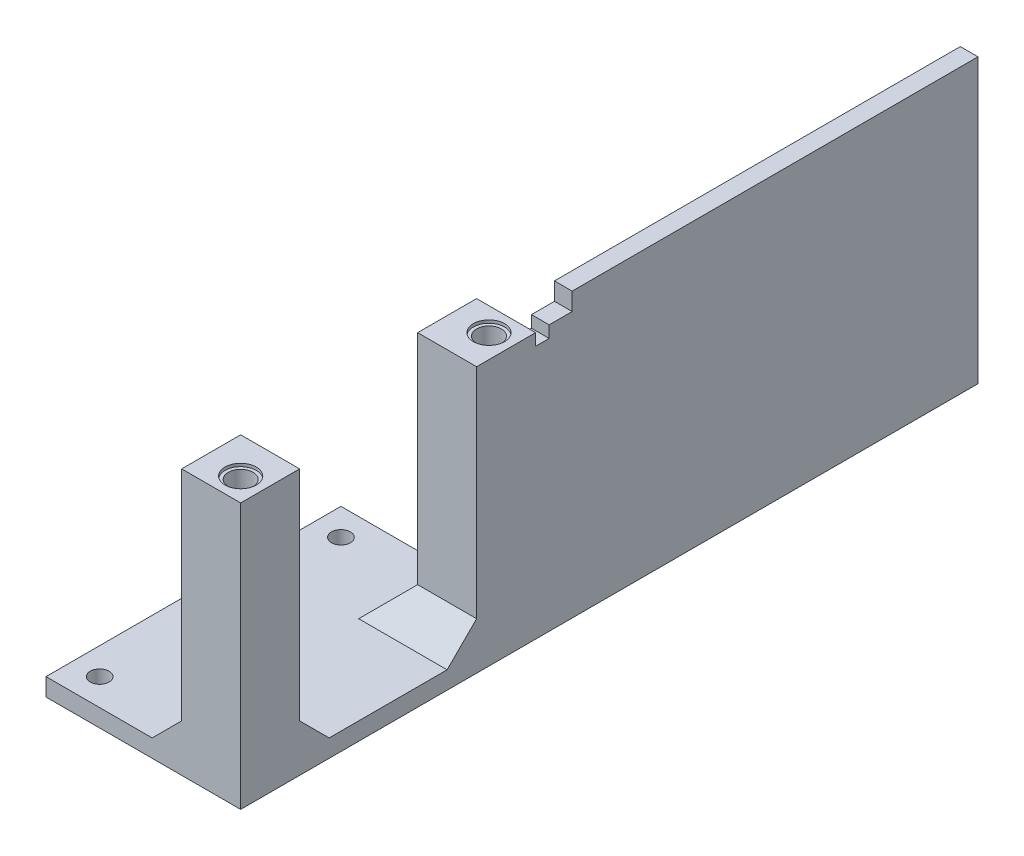
ISO-10303-21;
HEADER;
FILE_DESCRIPTION(('STEP AP214'),'2;1');
FILE_NAME('part.step','',(''),(''),'','','');
FILE_SCHEMA(('AUTOMOTIVE_DESIGN { 1 0 10303 214 1 1 1 1 }'));
ENDSEC;
DATA;
#1=APPLICATION_CONTEXT('core data for automotive mechanical design processes');
#2=APPLICATION_PROTOCOL_DEFINITION('international standard','automotive_design',2000,#1);
#3=PRODUCT_CONTEXT('',#1,'mechanical');
#4=PRODUCT('Part','Part','',(#3));
#5=PRODUCT_RELATED_PRODUCT_CATEGORY('part','',(#4));
#6=PRODUCT_DEFINITION_FORMATION('','',#4);
#7=PRODUCT_DEFINITION_CONTEXT('part definition',#1,'design');
#8=PRODUCT_DEFINITION('design','',#6,#7);
#9=PRODUCT_DEFINITION_SHAPE('','',#8);
#10=(LENGTH_UNIT() NAMED_UNIT(*) SI_UNIT(.MILLI.,.METRE.));
#11=(NAMED_UNIT(*) PLANE_ANGLE_UNIT() SI_UNIT($,.RADIAN.));
#12=(NAMED_UNIT(*) SI_UNIT($,.STERADIAN.) SOLID_ANGLE_UNIT());
#13=UNCERTAINTY_MEASURE_WITH_UNIT(LENGTH_MEASURE(1.E-05),#10,'distance_accuracy_value','');
#14=(GEOMETRIC_REPRESENTATION_CONTEXT(3) GLOBAL_UNCERTAINTY_ASSIGNED_CONTEXT((#13)) GLOBAL_UNIT_ASSIGNED_CONTEXT((#10,
#11,#12)) REPRESENTATION_CONTEXT('',''));
#15=CARTESIAN_POINT('',(0.,0.,0.));
#16=DIRECTION('',(0.,0.,1.));
#17=DIRECTION('',(1.,0.,0.));
#18=AXIS2_PLACEMENT_3D('',#15,#16,#17);
#19=CARTESIAN_POINT('',(0.,45.,0.));
#20=DIRECTION('',(0.,-1.,0.));
#21=DIRECTION('',(0.,0.,-1.));
#22=AXIS2_PLACEMENT_3D('',#19,#20,#21);
#23=PLANE('',#22);
#24=DIRECTION('',(1.,0.,0.));
#25=VECTOR('',#24,1.);
#26=CARTESIAN_POINT('',(23.4876033057851,45.,-15.8859504132231));
#27=LINE('',#26,#25);
#28=CARTESIAN_POINT('',(23.4876033057851,45.,-15.8859504132231));
#29=VERTEX_POINT('',#28);
#30=CARTESIAN_POINT('',(26.4876033057851,45.,-15.8859504132231));
#31=VERTEX_POINT('',#30);
#32=EDGE_CURVE('E106',#29,#31,#27,.T.);
#33=ORIENTED_EDGE('',*,*,#32,.F.);
#34=DIRECTION('',(0.,0.,1.));
#35=VECTOR('',#34,1.);
#36=CARTESIAN_POINT('',(23.4876033057851,45.,-11.9859504132231));
#37=LINE('',#36,#35);
#38=CARTESIAN_POINT('',(23.4876033057851,45.,-11.9859504132231));
#39=VERTEX_POINT('',#38);
#40=EDGE_CURVE('E247',#29,#39,#37,.T.);
#41=ORIENTED_EDGE('',*,*,#40,.T.);
#42=DIRECTION('',(1.,0.,0.));
#43=VECTOR('',#42,1.);
#44=CARTESIAN_POINT('',(23.4876033057851,45.,-11.9859504132231));
#45=LINE('',#44,#43);
#46=CARTESIAN_POINT('',(26.4876033057851,45.,-11.9859504132231));
#47=VERTEX_POINT('',#46);
#48=EDGE_CURVE('E259',#39,#47,#45,.T.);
#49=ORIENTED_EDGE('',*,*,#48,.T.);
#50=DIRECTION('',(0.,0.,-1.));
#51=VECTOR('',#50,1.);
#52=CARTESIAN_POINT('',(26.4876033057851,45.,-11.9859504132231));
#53=LINE('',#52,#51);
#54=EDGE_CURVE('E102',#47,#31,#53,.T.);
#55=ORIENTED_EDGE('',*,*,#54,.T.);
#56=EDGE_LOOP('',(#33,#41,#49,#55));
#57=FACE_BOUND('',#56,.T.);
#58=ADVANCED_FACE('F83',(#57),#23,.F.);
#59=CARTESIAN_POINT('',(26.4876033057851,43.,-84.6859504132231));
#60=DIRECTION('',(0.,-1.,0.));
#61=DIRECTION('',(0.,0.,-1.));
#62=AXIS2_PLACEMENT_3D('',#59,#60,#61);
#63=PLANE('',#62);
#64=DIRECTION('',(1.,0.,0.));
#65=VECTOR('',#64,1.);
#66=CARTESIAN_POINT('',(23.4876033057851,43.,-11.9859504132231));
#67=LINE('',#66,#65);
#68=CARTESIAN_POINT('',(23.4876033057851,43.,-11.9859504132231));
#69=VERTEX_POINT('',#68);
#70=CARTESIAN_POINT('',(26.4876033057851,43.,-11.9859504132231));
#71=VERTEX_POINT('',#70);
#72=EDGE_CURVE('E249',#69,#71,#67,.T.);
#73=ORIENTED_EDGE('',*,*,#72,.F.);
#74=DIRECTION('',(0.,0.,1.));
#75=VECTOR('',#74,1.);
#76=CARTESIAN_POINT('',(23.4876033057851,43.,-84.6859504132231));
#77=LINE('',#76,#75);
#78=CARTESIAN_POINT('',(23.4876033057851,43.,-9.68595041322314));
#79=VERTEX_POINT('',#78);
#80=EDGE_CURVE('E291',#69,#79,#77,.T.);
#81=ORIENTED_EDGE('',*,*,#80,.T.);
#82=DIRECTION('',(1.,0.,0.));
#83=VECTOR('',#82,1.);
#84=CARTESIAN_POINT('',(26.4876033057851,43.,-9.68595041322314));
#85=LINE('',#84,#83);
#86=CARTESIAN_POINT('',(26.4876033057851,43.,-9.68595041322314));
#87=VERTEX_POINT('',#86);
#88=EDGE_CURVE('E277',#79,#87,#85,.T.);
#89=ORIENTED_EDGE('',*,*,#88,.T.);
#90=DIRECTION('',(0.,0.,1.));
#91=VECTOR('',#90,1.);
#92=CARTESIAN_POINT('',(26.4876033057851,43.,-84.6859504132231));
#93=LINE('',#92,#91);
#94=EDGE_CURVE('E283',#71,#87,#93,.T.);
#95=ORIENTED_EDGE('',*,*,#94,.F.);
#96=EDGE_LOOP('',(#73,#81,#89,#95));
#97=FACE_BOUND('',#96,.T.);
#98=ADVANCED_FACE('F505',(#97),#63,.F.);
#99=CARTESIAN_POINT('',(22.5376033057851,-7.,-5.73595041322314));
#100=DIRECTION('',(0.,1.,0.));
#101=DIRECTION('',(0.,0.,1.));
#102=AXIS2_PLACEMENT_3D('',#99,#100,#101);
#103=CYLINDRICAL_SURFACE('',#102,2.1);
#104=CARTESIAN_POINT('',(22.5376033057851,44.5,-5.73595041322314));
#105=DIRECTION('',(0.,1.,0.));
#106=DIRECTION('',(0.,0.,1.));
#107=AXIS2_PLACEMENT_3D('',#104,#105,#106);
#108=CIRCLE('',#107,2.1);
#109=CARTESIAN_POINT('',(22.5376033057851,44.5,-3.63595041322314));
#110=VERTEX_POINT('',#109);
#111=EDGE_CURVE('E486',#110,#110,#108,.F.);
#112=ORIENTED_EDGE('',*,*,#111,.F.);
#113=EDGE_LOOP('',(#112));
#114=FACE_BOUND('',#113,.T.);
#115=CARTESIAN_POINT('',(22.5376033057851,0.5,-5.73595041322314));
#116=DIRECTION('',(0.,-1.,0.));
#117=DIRECTION('',(0.,0.,-1.));
#118=AXIS2_PLACEMENT_3D('',#115,#116,#117);
#119=CIRCLE('',#118,2.1);
#120=CARTESIAN_POINT('',(22.5376033057851,0.5,-7.83595041322314));
#121=VERTEX_POINT('',#120);
#122=EDGE_CURVE('E88',#121,#121,#119,.F.);
#123=ORIENTED_EDGE('',*,*,#122,.F.);
#124=EDGE_LOOP('',(#123));
#125=FACE_BOUND('',#124,.T.);
#126=ADVANCED_FACE('F502',(#114,#125),#103,.F.);
#127=CARTESIAN_POINT('',(22.5376033057851,-7.,36.3640495867769));
#128=DIRECTION('',(0.,1.,0.));
#129=DIRECTION('',(0.,0.,1.));
#130=AXIS2_PLACEMENT_3D('',#127,#128,#129);
#131=CYLINDRICAL_SURFACE('',#130,2.1);
#132=CARTESIAN_POINT('',(22.5376033057851,44.5,36.3640495867769));
#133=DIRECTION('',(0.,1.,0.));
#134=DIRECTION('',(0.,0.,1.));
#135=AXIS2_PLACEMENT_3D('',#132,#133,#134);
#136=CIRCLE('',#135,2.1);
#137=CARTESIAN_POINT('',(22.5376033057851,44.5,38.4640495867769));
#138=VERTEX_POINT('',#137);
#139=EDGE_CURVE('E319',#138,#138,#136,.F.);
#140=ORIENTED_EDGE('',*,*,#139,.F.);
#141=EDGE_LOOP('',(#140));
#142=FACE_BOUND('',#141,.T.);
#143=CARTESIAN_POINT('',(22.5376033057851,0.5,36.3640495867769));
#144=DIRECTION('',(0.,-1.,0.));
#145=DIRECTION('',(0.,0.,-1.));
#146=AXIS2_PLACEMENT_3D('',#143,#144,#145);
#147=CIRCLE('',#146,2.1);
#148=CARTESIAN_POINT('',(22.5376033057851,0.5,34.2640495867769));
#149=VERTEX_POINT('',#148);
#150=EDGE_CURVE('E303',#149,#149,#147,.F.);
#151=ORIENTED_EDGE('',*,*,#150,.F.);
#152=EDGE_LOOP('',(#151));
#153=FACE_BOUND('',#152,.T.);
#154=ADVANCED_FACE('F504',(#142,#153),#131,.F.);
#155=CARTESIAN_POINT('',(0.,3.,0.));
#156=DIRECTION('',(0.,-1.,0.));
#157=DIRECTION('',(0.,0.,-1.));
#158=AXIS2_PLACEMENT_3D('',#155,#156,#157);
#159=PLANE('',#158);
#160=CARTESIAN_POINT('',(-1.96239669421488,3.,-5.13595041322314));
#161=DIRECTION('',(0.,1.,0.));
#162=DIRECTION('',(0.,0.,1.));
#163=AXIS2_PLACEMENT_3D('',#160,#161,#162);
#164=CIRCLE('',#163,1.6);
#165=CARTESIAN_POINT('',(-1.96239669421488,3.,-3.53595041322314));
#166=VERTEX_POINT('',#165);
#167=EDGE_CURVE('E393',#166,#166,#164,.T.);
#168=ORIENTED_EDGE('',*,*,#167,.F.);
#169=EDGE_LOOP('',(#168));
#170=FACE_BOUND('',#169,.T.);
#171=CARTESIAN_POINT('',(-1.96239669421487,3.,35.7640495867769));
#172=DIRECTION('',(0.,1.,0.));
#173=DIRECTION('',(0.,0.,1.));
#174=AXIS2_PLACEMENT_3D('',#171,#172,#173);
#175=CIRCLE('',#174,1.6);
#176=CARTESIAN_POINT('',(-1.96239669421487,3.,37.3640495867769));
#177=VERTEX_POINT('',#176);
#178=EDGE_CURVE('E385',#177,#177,#175,.T.);
#179=ORIENTED_EDGE('',*,*,#178,.F.);
#180=EDGE_LOOP('',(#179));
#181=FACE_BOUND('',#180,.T.);
#182=DIRECTION('',(-1.,0.,0.));
#183=VECTOR('',#182,1.);
#184=CARTESIAN_POINT('',(16.4876033057851,3.,5.31404958677684));
#185=LINE('',#184,#183);
#186=CARTESIAN_POINT('',(26.4876033057851,3.,5.31404958677684));
#187=VERTEX_POINT('',#186);
#188=CARTESIAN_POINT('',(11.4876033057851,3.,5.31404958677685));
#189=VERTEX_POINT('',#188);
#190=EDGE_CURVE('E456',#187,#189,#185,.T.);
#191=ORIENTED_EDGE('',*,*,#190,.T.);
#192=DIRECTION('',(0.,0.,-1.));
#193=VECTOR('',#192,1.);
#194=CARTESIAN_POINT('',(11.4876033057851,3.,-9.68595041322314));
#195=LINE('',#194,#193);
#196=CARTESIAN_POINT('',(11.4876033057851,3.,-9.68595041322314));
#197=VERTEX_POINT('',#196);
#198=EDGE_CURVE('E459',#189,#197,#195,.T.);
#199=ORIENTED_EDGE('',*,*,#198,.T.);
#200=DIRECTION('',(1.,0.,0.));
#201=VECTOR('',#200,1.);
#202=CARTESIAN_POINT('',(-6.51239669421488,3.,-9.68595041322314));
#203=LINE('',#202,#201);
#204=CARTESIAN_POINT('',(-6.51239669421488,3.,-9.68595041322314));
#205=VERTEX_POINT('',#204);
#206=EDGE_CURVE('E401',#205,#197,#203,.T.);
#207=ORIENTED_EDGE('',*,*,#206,.F.);
#208=DIRECTION('',(0.,0.,1.));
#209=VECTOR('',#208,1.);
#210=CARTESIAN_POINT('',(-6.51239669421488,3.,-9.68595041322314));
#211=LINE('',#210,#209);
#212=CARTESIAN_POINT('',(-6.51239669421487,3.,40.3140495867769));
#213=VERTEX_POINT('',#212);
#214=EDGE_CURVE('E414',#205,#213,#211,.T.);
#215=ORIENTED_EDGE('',*,*,#214,.T.);
#216=DIRECTION('',(1.,0.,0.));
#217=VECTOR('',#216,1.);
#218=CARTESIAN_POINT('',(1.48760330578513,3.,40.3140495867769));
#219=LINE('',#218,#217);
#220=CARTESIAN_POINT('',(11.4876033057852,3.,40.3140495867769));
#221=VERTEX_POINT('',#220);
#222=EDGE_CURVE('E410',#213,#221,#219,.T.);
#223=ORIENTED_EDGE('',*,*,#222,.T.);
#224=DIRECTION('',(0.,0.,-1.));
#225=VECTOR('',#224,1.);
#226=CARTESIAN_POINT('',(11.4876033057852,3.,30.3140495867769));
#227=LINE('',#226,#225);
#228=CARTESIAN_POINT('',(11.4876033057852,3.,25.3140495867769));
#229=VERTEX_POINT('',#228);
#230=EDGE_CURVE('E453',#221,#229,#227,.T.);
#231=ORIENTED_EDGE('',*,*,#230,.T.);
#232=DIRECTION('',(1.,0.,0.));
#233=VECTOR('',#232,1.);
#234=CARTESIAN_POINT('',(26.4876033057851,3.,25.3140495867769));
#235=LINE('',#234,#233);
#236=CARTESIAN_POINT('',(26.4876033057851,3.,25.3140495867769));
#237=VERTEX_POINT('',#236);
#238=EDGE_CURVE('E450',#229,#237,#235,.T.);
#239=ORIENTED_EDGE('',*,*,#238,.T.);
#240=DIRECTION('',(0.,0.,1.));
#241=VECTOR('',#240,1.);
#242=CARTESIAN_POINT('',(26.4876033057851,3.,-9.68595041322314));
#243=LINE('',#242,#241);
#244=EDGE_CURVE('E405',#187,#237,#243,.T.);
#245=ORIENTED_EDGE('',*,*,#244,.F.);
#246=EDGE_LOOP('',(#191,#199,#207,#215,#223,#231,#239,#245));
#247=FACE_BOUND('',#246,.T.);
#248=ADVANCED_FACE('F511',(#170,#181,#247),#159,.F.);
#249=CARTESIAN_POINT('',(0.,0.,0.));
#250=DIRECTION('',(0.,-1.,0.));
#251=DIRECTION('',(0.,0.,-1.));
#252=AXIS2_PLACEMENT_3D('',#249,#250,#251);
#253=PLANE('',#252);
#254=CARTESIAN_POINT('',(22.5376033057851,0.,36.3640495867769));
#255=DIRECTION('',(0.,1.,0.));
#256=DIRECTION('',(0.,0.,1.));
#257=AXIS2_PLACEMENT_3D('',#254,#255,#256);
#258=CIRCLE('',#257,2.65);
#259=CARTESIAN_POINT('',(22.5376033057851,0.,39.0140495867769));
#260=VERTEX_POINT('',#259);
#261=EDGE_CURVE('E304',#260,#260,#258,.T.);
#262=ORIENTED_EDGE('',*,*,#261,.T.);
#263=EDGE_LOOP('',(#262));
#264=FACE_BOUND('',#263,.T.);
#265=CARTESIAN_POINT('',(22.5376033057851,0.,-5.73595041322314));
#266=DIRECTION('',(0.,1.,0.));
#267=DIRECTION('',(0.,0.,1.));
#268=AXIS2_PLACEMENT_3D('',#265,#266,#267);
#269=CIRCLE('',#268,2.65);
#270=CARTESIAN_POINT('',(22.5376033057851,0.,-3.08595041322314));
#271=VERTEX_POINT('',#270);
#272=EDGE_CURVE('E298',#271,#271,#269,.T.);
#273=ORIENTED_EDGE('',*,*,#272,.T.);
#274=EDGE_LOOP('',(#273));
#275=FACE_BOUND('',#274,.T.);
#276=CARTESIAN_POINT('',(-1.96239669421488,0.,-5.13595041322314));
#277=DIRECTION('',(0.,1.,0.));
#278=DIRECTION('',(0.,0.,1.));
#279=AXIS2_PLACEMENT_3D('',#276,#277,#278);
#280=CIRCLE('',#279,1.6);
#281=CARTESIAN_POINT('',(-1.96239669421488,0.,-3.53595041322314));
#282=VERTEX_POINT('',#281);
#283=EDGE_CURVE('E389',#282,#282,#280,.T.);
#284=ORIENTED_EDGE('',*,*,#283,.T.);
#285=EDGE_LOOP('',(#284));
#286=FACE_BOUND('',#285,.T.);
#287=DIRECTION('',(0.,0.,1.));
#288=VECTOR('',#287,1.);
#289=CARTESIAN_POINT('',(-6.51239669421488,0.,-9.68595041322314));
#290=LINE('',#289,#288);
#291=CARTESIAN_POINT('',(-6.51239669421488,0.,-9.68595041322314));
#292=VERTEX_POINT('',#291);
#293=CARTESIAN_POINT('',(-6.51239669421487,0.,40.3140495867769));
#294=VERTEX_POINT('',#293);
#295=EDGE_CURVE('E406',#292,#294,#290,.T.);
#296=ORIENTED_EDGE('',*,*,#295,.F.);
#297=DIRECTION('',(1.,0.,0.));
#298=VECTOR('',#297,1.);
#299=CARTESIAN_POINT('',(1.48760330578512,0.,-9.68595041322314));
#300=LINE('',#299,#298);
#301=CARTESIAN_POINT('',(23.4876033057851,0.,-9.68595041322314));
#302=VERTEX_POINT('',#301);
#303=EDGE_CURVE('E397',#292,#302,#300,.T.);
#304=ORIENTED_EDGE('',*,*,#303,.T.);
#305=DIRECTION('',(0.,0.,1.));
#306=VECTOR('',#305,1.);
#307=CARTESIAN_POINT('',(23.4876033057851,0.,-84.6859504132231));
#308=LINE('',#307,#306);
#309=CARTESIAN_POINT('',(23.4876033057851,0.,-84.6859504132231));
#310=VERTEX_POINT('',#309);
#311=EDGE_CURVE('E294',#310,#302,#308,.T.);
#312=ORIENTED_EDGE('',*,*,#311,.F.);
#313=DIRECTION('',(-1.,0.,0.));
#314=VECTOR('',#313,1.);
#315=CARTESIAN_POINT('',(26.4876033057851,0.,-84.6859504132231));
#316=LINE('',#315,#314);
#317=CARTESIAN_POINT('',(26.4876033057851,0.,-84.6859504132231));
#318=VERTEX_POINT('',#317);
#319=EDGE_CURVE('E276',#318,#310,#316,.T.);
#320=ORIENTED_EDGE('',*,*,#319,.F.);
#321=DIRECTION('',(0.,0.,1.));
#322=VECTOR('',#321,1.);
#323=CARTESIAN_POINT('',(26.4876033057851,0.,-9.68595041322314));
#324=LINE('',#323,#322);
#325=CARTESIAN_POINT('',(26.4876033057851,0.,40.3140495867769));
#326=VERTEX_POINT('',#325);
#327=EDGE_CURVE('E422',#318,#326,#324,.T.);
#328=ORIENTED_EDGE('',*,*,#327,.T.);
#329=DIRECTION('',(1.,0.,0.));
#330=VECTOR('',#329,1.);
#331=CARTESIAN_POINT('',(-6.51239669421487,0.,40.3140495867769));
#332=LINE('',#331,#330);
#333=EDGE_CURVE('E426',#294,#326,#332,.T.);
#334=ORIENTED_EDGE('',*,*,#333,.F.);
#335=EDGE_LOOP('',(#296,#304,#312,#320,#328,#334));
#336=FACE_BOUND('',#335,.T.);
#337=CARTESIAN_POINT('',(-1.96239669421487,0.,35.7640495867769));
#338=DIRECTION('',(0.,1.,0.));
#339=DIRECTION('',(0.,0.,1.));
#340=AXIS2_PLACEMENT_3D('',#337,#338,#339);
#341=CIRCLE('',#340,1.6);
#342=CARTESIAN_POINT('',(-1.96239669421487,0.,37.3640495867769));
#343=VERTEX_POINT('',#342);
#344=EDGE_CURVE('E384',#343,#343,#341,.T.);
#345=ORIENTED_EDGE('',*,*,#344,.T.);
#346=EDGE_LOOP('',(#345));
#347=FACE_BOUND('',#346,.T.);
#348=ADVANCED_FACE('F646',(#264,#275,#286,#336,#347),#253,.T.);
#349=CARTESIAN_POINT('',(-6.51239669421488,3.,-9.68595041322314));
#350=DIRECTION('',(1.,0.,0.));
#351=DIRECTION('',(0.,0.,-1.));
#352=AXIS2_PLACEMENT_3D('',#349,#350,#351);
#353=PLANE('',#352);
#354=ORIENTED_EDGE('',*,*,#295,.T.);
#355=DIRECTION('',(0.,-1.,0.));
#356=VECTOR('',#355,1.);
#357=CARTESIAN_POINT('',(-6.51239669421487,3.,40.3140495867769));
#358=LINE('',#357,#356);
#359=EDGE_CURVE('E436',#213,#294,#358,.T.);
#360=ORIENTED_EDGE('',*,*,#359,.F.);
#361=ORIENTED_EDGE('',*,*,#214,.F.);
#362=DIRECTION('',(0.,-1.,0.));
#363=VECTOR('',#362,1.);
#364=CARTESIAN_POINT('',(-6.51239669421488,3.,-9.68595041322314));
#365=LINE('',#364,#363);
#366=EDGE_CURVE('E431',#205,#292,#365,.T.);
#367=ORIENTED_EDGE('',*,*,#366,.T.);
#368=EDGE_LOOP('',(#354,#360,#361,#367));
#369=FACE_BOUND('',#368,.T.);
#370=ADVANCED_FACE('F650',(#369),#353,.F.);
#371=CARTESIAN_POINT('',(-6.51239669421487,3.,40.3140495867769));
#372=DIRECTION('',(0.,0.,-1.));
#373=DIRECTION('',(-1.,0.,0.));
#374=AXIS2_PLACEMENT_3D('',#371,#372,#373);
#375=PLANE('',#374);
#376=ORIENTED_EDGE('',*,*,#333,.T.);
#377=DIRECTION('',(0.,-1.,0.));
#378=VECTOR('',#377,1.);
#379=CARTESIAN_POINT('',(26.4876033057851,3.,40.3140495867769));
#380=LINE('',#379,#378);
#381=CARTESIAN_POINT('',(26.4876033057851,45.,40.3140495867769));
#382=VERTEX_POINT('',#381);
#383=EDGE_CURVE('E440',#382,#326,#380,.T.);
#384=ORIENTED_EDGE('',*,*,#383,.F.);
#385=DIRECTION('',(1.,0.,0.));
#386=VECTOR('',#385,1.);
#387=CARTESIAN_POINT('',(26.4876033057851,45.,40.3140495867769));
#388=LINE('',#387,#386);
#389=CARTESIAN_POINT('',(16.4876033057851,45.,40.3140495867769));
#390=VERTEX_POINT('',#389);
#391=EDGE_CURVE('E368',#390,#382,#388,.T.);
#392=ORIENTED_EDGE('',*,*,#391,.F.);
#393=DIRECTION('',(0.,-1.,0.));
#394=VECTOR('',#393,1.);
#395=CARTESIAN_POINT('',(16.4876033057851,45.,40.3140495867769));
#396=LINE('',#395,#394);
#397=CARTESIAN_POINT('',(16.4876033057851,8.00000000000004,40.3140495867769));
#398=VERTEX_POINT('',#397);
#399=EDGE_CURVE('E372',#390,#398,#396,.T.);
#400=ORIENTED_EDGE('',*,*,#399,.T.);
#401=DIRECTION('',(0.707106781186544,0.707106781186551,0.));
#402=VECTOR('',#401,1.);
#403=CARTESIAN_POINT('',(2.48760330578524,-6.00000000000001,40.3140495867769));
#404=LINE('',#403,#402);
#405=EDGE_CURVE('E94',#398,#221,#404,.F.);
#406=ORIENTED_EDGE('',*,*,#405,.T.);
#407=ORIENTED_EDGE('',*,*,#222,.F.);
#408=ORIENTED_EDGE('',*,*,#359,.T.);
#409=EDGE_LOOP('',(#376,#384,#392,#400,#406,#407,#408));
#410=FACE_BOUND('',#409,.T.);
#411=ADVANCED_FACE('F621',(#410),#375,.F.);
#412=CARTESIAN_POINT('',(26.4876033057851,3.,-9.68595041322314));
#413=DIRECTION('',(1.,0.,0.));
#414=DIRECTION('',(0.,0.,-1.));
#415=AXIS2_PLACEMENT_3D('',#412,#413,#414);
#416=PLANE('',#415);
#417=ORIENTED_EDGE('',*,*,#327,.F.);
#418=DIRECTION('',(0.,-1.,0.));
#419=VECTOR('',#418,1.);
#420=CARTESIAN_POINT('',(26.4876033057851,43.,-84.6859504132231));
#421=LINE('',#420,#419);
#422=CARTESIAN_POINT('',(26.4876033057851,48.,-84.6859504132231));
#423=VERTEX_POINT('',#422);
#424=EDGE_CURVE('E272',#423,#318,#421,.T.);
#425=ORIENTED_EDGE('',*,*,#424,.F.);
#426=DIRECTION('',(0.,0.,-1.));
#427=VECTOR('',#426,1.);
#428=CARTESIAN_POINT('',(26.4876033057851,48.,-84.6859504132231));
#429=LINE('',#428,#427);
#430=CARTESIAN_POINT('',(26.4876033057851,48.,-15.8859504132231));
#431=VERTEX_POINT('',#430);
#432=EDGE_CURVE('E232',#431,#423,#429,.T.);
#433=ORIENTED_EDGE('',*,*,#432,.F.);
#434=DIRECTION('',(0.,-1.,0.));
#435=VECTOR('',#434,1.);
#436=CARTESIAN_POINT('',(26.4876033057851,48.,-15.8859504132231));
#437=LINE('',#436,#435);
#438=EDGE_CURVE('E227',#431,#31,#437,.T.);
#439=ORIENTED_EDGE('',*,*,#438,.T.);
#440=ORIENTED_EDGE('',*,*,#54,.F.);
#441=DIRECTION('',(0.,-1.,0.));
#442=VECTOR('',#441,1.);
#443=CARTESIAN_POINT('',(26.4876033057851,45.,-11.9859504132231));
#444=LINE('',#443,#442);
#445=EDGE_CURVE('E263',#47,#71,#444,.T.);
#446=ORIENTED_EDGE('',*,*,#445,.T.);
#447=ORIENTED_EDGE('',*,*,#94,.T.);
#448=DIRECTION('',(0.,-1.,0.));
#449=VECTOR('',#448,1.);
#450=CARTESIAN_POINT('',(26.4876033057851,3.,-9.68595041322314));
#451=LINE('',#450,#449);
#452=CARTESIAN_POINT('',(26.4876033057851,45.,-9.68595041322314));
#453=VERTEX_POINT('',#452);
#454=EDGE_CURVE('E418',#453,#87,#451,.T.);
#455=ORIENTED_EDGE('',*,*,#454,.F.);
#456=DIRECTION('',(0.,0.,-1.));
#457=VECTOR('',#456,1.);
#458=CARTESIAN_POINT('',(26.4876033057851,45.,-9.68595041322314));
#459=LINE('',#458,#457);
#460=CARTESIAN_POINT('',(26.4876033057851,45.,0.314049586776862));
#461=VERTEX_POINT('',#460);
#462=EDGE_CURVE('E332',#461,#453,#459,.T.);
#463=ORIENTED_EDGE('',*,*,#462,.F.);
#464=DIRECTION('',(0.,-1.,0.));
#465=VECTOR('',#464,1.);
#466=CARTESIAN_POINT('',(26.4876033057851,45.,0.314049586776862));
#467=LINE('',#466,#465);
#468=CARTESIAN_POINT('',(26.4876033057851,8.00000000000006,0.314049586776862));
#469=VERTEX_POINT('',#468);
#470=EDGE_CURVE('E346',#461,#469,#467,.T.);
#471=ORIENTED_EDGE('',*,*,#470,.T.);
#472=DIRECTION('',(0.,0.707106781186552,-0.707106781186543));
#473=VECTOR('',#472,1.);
#474=CARTESIAN_POINT('',(26.4876033057851,8.00000000000004,0.314049586776862));
#475=LINE('',#474,#473);
#476=EDGE_CURVE('E475',#469,#187,#475,.F.);
#477=ORIENTED_EDGE('',*,*,#476,.T.);
#478=ORIENTED_EDGE('',*,*,#244,.T.);
#479=DIRECTION('',(0.,-0.707106781186551,-0.707106781186544));
#480=VECTOR('',#479,1.);
#481=CARTESIAN_POINT('',(26.4876033057851,8.00000000000003,30.3140495867769));
#482=LINE('',#481,#480);
#483=CARTESIAN_POINT('',(26.4876033057851,8.00000000000004,30.3140495867769));
#484=VERTEX_POINT('',#483);
#485=EDGE_CURVE('E12',#237,#484,#482,.F.);
#486=ORIENTED_EDGE('',*,*,#485,.T.);
#487=DIRECTION('',(0.,-1.,0.));
#488=VECTOR('',#487,1.);
#489=CARTESIAN_POINT('',(26.4876033057851,45.,30.3140495867769));
#490=LINE('',#489,#488);
#491=CARTESIAN_POINT('',(26.4876033057851,45.,30.3140495867769));
#492=VERTEX_POINT('',#491);
#493=EDGE_CURVE('E380',#492,#484,#490,.T.);
#494=ORIENTED_EDGE('',*,*,#493,.F.);
#495=DIRECTION('',(0.,0.,-1.));
#496=VECTOR('',#495,1.);
#497=CARTESIAN_POINT('',(26.4876033057851,45.,40.3140495867769));
#498=LINE('',#497,#496);
#499=EDGE_CURVE('E358',#382,#492,#498,.T.);
#500=ORIENTED_EDGE('',*,*,#499,.F.);
#501=ORIENTED_EDGE('',*,*,#383,.T.);
#502=EDGE_LOOP('',(#417,#425,#433,#439,#440,#446,#447,#455,#463,#471,#477,#478,#486,#494,#500,#501));
#503=FACE_BOUND('',#502,.T.);
#504=ADVANCED_FACE('F586',(#503),#416,.T.);
#505=CARTESIAN_POINT('',(1.48760330578512,3.,-9.68595041322314));
#506=DIRECTION('',(0.,0.,-1.));
#507=DIRECTION('',(-1.,0.,0.));
#508=AXIS2_PLACEMENT_3D('',#505,#506,#507);
#509=PLANE('',#508);
#510=ORIENTED_EDGE('',*,*,#88,.F.);
#511=DIRECTION('',(0.,1.,0.));
#512=VECTOR('',#511,1.);
#513=CARTESIAN_POINT('',(23.4876033057851,43.,-9.68595041322314));
#514=LINE('',#513,#512);
#515=EDGE_CURVE('E271',#302,#79,#514,.T.);
#516=ORIENTED_EDGE('',*,*,#515,.F.);
#517=ORIENTED_EDGE('',*,*,#303,.F.);
#518=ORIENTED_EDGE('',*,*,#366,.F.);
#519=ORIENTED_EDGE('',*,*,#206,.T.);
#520=DIRECTION('',(-0.707106781186543,-0.707106781186552,0.));
#521=VECTOR('',#520,1.);
#522=CARTESIAN_POINT('',(16.4876033057851,8.00000000000004,-9.68595041322314));
#523=LINE('',#522,#521);
#524=CARTESIAN_POINT('',(16.4876033057851,8.00000000000006,-9.68595041322314));
#525=VERTEX_POINT('',#524);
#526=EDGE_CURVE('E472',#197,#525,#523,.F.);
#527=ORIENTED_EDGE('',*,*,#526,.T.);
#528=DIRECTION('',(0.,-1.,0.));
#529=VECTOR('',#528,1.);
#530=CARTESIAN_POINT('',(16.4876033057851,45.,-9.68595041322314));
#531=LINE('',#530,#529);
#532=CARTESIAN_POINT('',(16.4876033057851,45.,-9.68595041322314));
#533=VERTEX_POINT('',#532);
#534=EDGE_CURVE('E354',#533,#525,#531,.T.);
#535=ORIENTED_EDGE('',*,*,#534,.F.);
#536=DIRECTION('',(-1.,0.,0.));
#537=VECTOR('',#536,1.);
#538=CARTESIAN_POINT('',(26.4876033057851,45.,-9.68595041322314));
#539=LINE('',#538,#537);
#540=EDGE_CURVE('E336',#453,#533,#539,.T.);
#541=ORIENTED_EDGE('',*,*,#540,.F.);
#542=ORIENTED_EDGE('',*,*,#454,.T.);
#543=EDGE_LOOP('',(#510,#516,#517,#518,#519,#527,#535,#541,#542));
#544=FACE_BOUND('',#543,.T.);
#545=ADVANCED_FACE('F591',(#544),#509,.T.);
#546=CARTESIAN_POINT('',(-1.96239669421488,3.,-5.13595041322314));
#547=DIRECTION('',(0.,-1.,0.));
#548=DIRECTION('',(0.,0.,-1.));
#549=AXIS2_PLACEMENT_3D('',#546,#547,#548);
#550=CYLINDRICAL_SURFACE('',#549,1.6);
#551=ORIENTED_EDGE('',*,*,#167,.T.);
#552=EDGE_LOOP('',(#551));
#553=FACE_BOUND('',#552,.T.);
#554=ORIENTED_EDGE('',*,*,#283,.F.);
#555=EDGE_LOOP('',(#554));
#556=FACE_BOUND('',#555,.T.);
#557=ADVANCED_FACE('F636',(#553,#556),#550,.F.);
#558=CARTESIAN_POINT('',(-1.96239669421487,3.,35.7640495867769));
#559=DIRECTION('',(0.,-1.,0.));
#560=DIRECTION('',(0.,0.,-1.));
#561=AXIS2_PLACEMENT_3D('',#558,#559,#560);
#562=CYLINDRICAL_SURFACE('',#561,1.6);
#563=ORIENTED_EDGE('',*,*,#178,.T.);
#564=EDGE_LOOP('',(#563));
#565=FACE_BOUND('',#564,.T.);
#566=ORIENTED_EDGE('',*,*,#344,.F.);
#567=EDGE_LOOP('',(#566));
#568=FACE_BOUND('',#567,.T.);
#569=ADVANCED_FACE('F629',(#565,#568),#562,.F.);
#570=CARTESIAN_POINT('',(26.4876033057851,45.,30.3140495867769));
#571=DIRECTION('',(0.,0.,1.));
#572=DIRECTION('',(1.,0.,0.));
#573=AXIS2_PLACEMENT_3D('',#570,#571,#572);
#574=PLANE('',#573);
#575=ORIENTED_EDGE('',*,*,#493,.T.);
#576=DIRECTION('',(-1.,0.,0.));
#577=VECTOR('',#576,1.);
#578=CARTESIAN_POINT('',(16.4876033057851,8.00000000000003,30.3140495867769));
#579=LINE('',#578,#577);
#580=CARTESIAN_POINT('',(16.4876033057851,8.00000000000004,30.3140495867769));
#581=VERTEX_POINT('',#580);
#582=EDGE_CURVE('E469',#484,#581,#579,.T.);
#583=ORIENTED_EDGE('',*,*,#582,.T.);
#584=DIRECTION('',(0.,-1.,0.));
#585=VECTOR('',#584,1.);
#586=CARTESIAN_POINT('',(16.4876033057851,45.,30.3140495867769));
#587=LINE('',#586,#585);
#588=CARTESIAN_POINT('',(16.4876033057851,45.,30.3140495867769));
#589=VERTEX_POINT('',#588);
#590=EDGE_CURVE('E376',#589,#581,#587,.T.);
#591=ORIENTED_EDGE('',*,*,#590,.F.);
#592=DIRECTION('',(-1.,0.,0.));
#593=VECTOR('',#592,1.);
#594=CARTESIAN_POINT('',(26.4876033057851,45.,30.3140495867769));
#595=LINE('',#594,#593);
#596=EDGE_CURVE('E362',#492,#589,#595,.T.);
#597=ORIENTED_EDGE('',*,*,#596,.F.);
#598=EDGE_LOOP('',(#575,#583,#591,#597));
#599=FACE_BOUND('',#598,.T.);
#600=ADVANCED_FACE('F627',(#599),#574,.F.);
#601=CARTESIAN_POINT('',(16.4876033057851,45.,40.3140495867769));
#602=DIRECTION('',(1.,0.,0.));
#603=DIRECTION('',(0.,0.,-1.));
#604=AXIS2_PLACEMENT_3D('',#601,#602,#603);
#605=PLANE('',#604);
#606=ORIENTED_EDGE('',*,*,#590,.T.);
#607=DIRECTION('',(0.,0.,1.));
#608=VECTOR('',#607,1.);
#609=CARTESIAN_POINT('',(16.4876033057851,8.00000000000003,40.3140495867769));
#610=LINE('',#609,#608);
#611=EDGE_CURVE('E465',#581,#398,#610,.T.);
#612=ORIENTED_EDGE('',*,*,#611,.T.);
#613=ORIENTED_EDGE('',*,*,#399,.F.);
#614=DIRECTION('',(0.,0.,1.));
#615=VECTOR('',#614,1.);
#616=CARTESIAN_POINT('',(16.4876033057851,45.,40.3140495867769));
#617=LINE('',#616,#615);
#618=EDGE_CURVE('E365',#589,#390,#617,.T.);
#619=ORIENTED_EDGE('',*,*,#618,.F.);
#620=EDGE_LOOP('',(#606,#612,#613,#619));
#621=FACE_BOUND('',#620,.T.);
#622=ADVANCED_FACE('F616',(#621),#605,.F.);
#623=CARTESIAN_POINT('',(0.,45.,0.));
#624=DIRECTION('',(0.,1.,0.));
#625=DIRECTION('',(0.,0.,1.));
#626=AXIS2_PLACEMENT_3D('',#623,#624,#625);
#627=PLANE('',#626);
#628=CARTESIAN_POINT('',(22.5376033057851,45.,36.3640495867769));
#629=DIRECTION('',(0.,1.,0.));
#630=DIRECTION('',(0.,0.,1.));
#631=AXIS2_PLACEMENT_3D('',#628,#629,#630);
#632=CIRCLE('',#631,2.65);
#633=CARTESIAN_POINT('',(22.5376033057851,45.,39.0140495867769));
#634=VERTEX_POINT('',#633);
#635=EDGE_CURVE('E320',#634,#634,#632,.T.);
#636=ORIENTED_EDGE('',*,*,#635,.F.);
#637=EDGE_LOOP('',(#636));
#638=FACE_BOUND('',#637,.T.);
#639=ORIENTED_EDGE('',*,*,#499,.T.);
#640=ORIENTED_EDGE('',*,*,#596,.T.);
#641=ORIENTED_EDGE('',*,*,#618,.T.);
#642=ORIENTED_EDGE('',*,*,#391,.T.);
#643=EDGE_LOOP('',(#639,#640,#641,#642));
#644=FACE_BOUND('',#643,.T.);
#645=ADVANCED_FACE('F624',(#638,#644),#627,.T.);
#646=CARTESIAN_POINT('',(16.4876033057851,45.,-9.68595041322314));
#647=DIRECTION('',(1.,0.,0.));
#648=DIRECTION('',(0.,0.,-1.));
#649=AXIS2_PLACEMENT_3D('',#646,#647,#648);
#650=PLANE('',#649);
#651=ORIENTED_EDGE('',*,*,#534,.T.);
#652=DIRECTION('',(0.,0.,1.));
#653=VECTOR('',#652,1.);
#654=CARTESIAN_POINT('',(16.4876033057851,8.00000000000004,0.314049586776863));
#655=LINE('',#654,#653);
#656=CARTESIAN_POINT('',(16.4876033057851,8.00000000000006,0.314049586776863));
#657=VERTEX_POINT('',#656);
#658=EDGE_CURVE('E435',#525,#657,#655,.T.);
#659=ORIENTED_EDGE('',*,*,#658,.T.);
#660=DIRECTION('',(0.,-1.,0.));
#661=VECTOR('',#660,1.);
#662=CARTESIAN_POINT('',(16.4876033057851,45.,0.314049586776863));
#663=LINE('',#662,#661);
#664=CARTESIAN_POINT('',(16.4876033057851,45.,0.314049586776863));
#665=VERTEX_POINT('',#664);
#666=EDGE_CURVE('E350',#665,#657,#663,.T.);
#667=ORIENTED_EDGE('',*,*,#666,.F.);
#668=DIRECTION('',(0.,0.,1.));
#669=VECTOR('',#668,1.);
#670=CARTESIAN_POINT('',(16.4876033057851,45.,-9.68595041322314));
#671=LINE('',#670,#669);
#672=EDGE_CURVE('E340',#533,#665,#671,.T.);
#673=ORIENTED_EDGE('',*,*,#672,.F.);
#674=EDGE_LOOP('',(#651,#659,#667,#673));
#675=FACE_BOUND('',#674,.T.);
#676=ADVANCED_FACE('F597',(#675),#650,.F.);
#677=CARTESIAN_POINT('',(26.4876033057851,45.,0.314049586776862));
#678=DIRECTION('',(0.,0.,-1.));
#679=DIRECTION('',(-1.,0.,0.));
#680=AXIS2_PLACEMENT_3D('',#677,#678,#679);
#681=PLANE('',#680);
#682=ORIENTED_EDGE('',*,*,#666,.T.);
#683=DIRECTION('',(1.,0.,0.));
#684=VECTOR('',#683,1.);
#685=CARTESIAN_POINT('',(26.4876033057851,8.00000000000004,0.314049586776862));
#686=LINE('',#685,#684);
#687=EDGE_CURVE('E462',#657,#469,#686,.T.);
#688=ORIENTED_EDGE('',*,*,#687,.T.);
#689=ORIENTED_EDGE('',*,*,#470,.F.);
#690=DIRECTION('',(1.,0.,0.));
#691=VECTOR('',#690,1.);
#692=CARTESIAN_POINT('',(26.4876033057851,45.,0.314049586776862));
#693=LINE('',#692,#691);
#694=EDGE_CURVE('E343',#665,#461,#693,.T.);
#695=ORIENTED_EDGE('',*,*,#694,.F.);
#696=EDGE_LOOP('',(#682,#688,#689,#695));
#697=FACE_BOUND('',#696,.T.);
#698=ADVANCED_FACE('F579',(#697),#681,.F.);
#699=CARTESIAN_POINT('',(0.,45.,0.));
#700=DIRECTION('',(0.,-1.,0.));
#701=DIRECTION('',(0.,0.,-1.));
#702=AXIS2_PLACEMENT_3D('',#699,#700,#701);
#703=PLANE('',#702);
#704=CARTESIAN_POINT('',(22.5376033057851,45.,-5.73595041322314));
#705=DIRECTION('',(0.,1.,0.));
#706=DIRECTION('',(0.,0.,1.));
#707=AXIS2_PLACEMENT_3D('',#704,#705,#706);
#708=CIRCLE('',#707,2.65);
#709=CARTESIAN_POINT('',(22.5376033057851,45.,-3.08595041322314));
#710=VERTEX_POINT('',#709);
#711=EDGE_CURVE('E328',#710,#710,#708,.T.);
#712=ORIENTED_EDGE('',*,*,#711,.F.);
#713=EDGE_LOOP('',(#712));
#714=FACE_BOUND('',#713,.T.);
#715=ORIENTED_EDGE('',*,*,#462,.T.);
#716=ORIENTED_EDGE('',*,*,#540,.T.);
#717=ORIENTED_EDGE('',*,*,#672,.T.);
#718=ORIENTED_EDGE('',*,*,#694,.T.);
#719=EDGE_LOOP('',(#715,#716,#717,#718));
#720=FACE_BOUND('',#719,.T.);
#721=ADVANCED_FACE('F575',(#714,#720),#703,.F.);
#722=CARTESIAN_POINT('',(26.4876033057851,8.00000000000004,0.314049586776862));
#723=DIRECTION('',(0.,0.707106781186543,0.707106781186552));
#724=DIRECTION('',(-1.,0.,0.));
#725=AXIS2_PLACEMENT_3D('',#722,#723,#724);
#726=PLANE('',#725);
#727=ORIENTED_EDGE('',*,*,#476,.F.);
#728=ORIENTED_EDGE('',*,*,#687,.F.);
#729=DIRECTION('',(-0.577350269189624,-0.57735026918963,0.577350269189623));
#730=VECTOR('',#729,1.);
#731=CARTESIAN_POINT('',(19.8209366391184,11.3333333333334,-3.01928374655645));
#732=LINE('',#731,#730);
#733=EDGE_CURVE('E337',#189,#657,#732,.F.);
#734=ORIENTED_EDGE('',*,*,#733,.F.);
#735=ORIENTED_EDGE('',*,*,#190,.F.);
#736=EDGE_LOOP('',(#727,#728,#734,#735));
#737=FACE_BOUND('',#736,.T.);
#738=ADVANCED_FACE('F578',(#737),#726,.T.);
#739=CARTESIAN_POINT('',(16.4876033057851,8.00000000000004,-9.68595041322314));
#740=DIRECTION('',(-0.707106781186552,0.707106781186543,0.));
#741=DIRECTION('',(0.,0.,-1.));
#742=AXIS2_PLACEMENT_3D('',#739,#740,#741);
#743=PLANE('',#742);
#744=ORIENTED_EDGE('',*,*,#526,.F.);
#745=ORIENTED_EDGE('',*,*,#198,.F.);
#746=ORIENTED_EDGE('',*,*,#733,.T.);
#747=ORIENTED_EDGE('',*,*,#658,.F.);
#748=EDGE_LOOP('',(#744,#745,#746,#747));
#749=FACE_BOUND('',#748,.T.);
#750=ADVANCED_FACE('F661',(#749),#743,.T.);
#751=CARTESIAN_POINT('',(26.4876033057851,8.00000000000003,30.3140495867769));
#752=DIRECTION('',(0.,0.707106781186544,-0.707106781186551));
#753=DIRECTION('',(1.,0.,0.));
#754=AXIS2_PLACEMENT_3D('',#751,#752,#753);
#755=PLANE('',#754);
#756=ORIENTED_EDGE('',*,*,#485,.F.);
#757=ORIENTED_EDGE('',*,*,#238,.F.);
#758=DIRECTION('',(0.577350269189624,0.57735026918963,0.577350269189624));
#759=VECTOR('',#758,1.);
#760=CARTESIAN_POINT('',(19.8209366391184,11.3333333333334,33.6473829201102));
#761=LINE('',#760,#759);
#762=EDGE_CURVE('E482',#581,#229,#761,.F.);
#763=ORIENTED_EDGE('',*,*,#762,.F.);
#764=ORIENTED_EDGE('',*,*,#582,.F.);
#765=EDGE_LOOP('',(#756,#757,#763,#764));
#766=FACE_BOUND('',#765,.T.);
#767=ADVANCED_FACE('F86',(#766),#755,.T.);
#768=CARTESIAN_POINT('',(16.4876033057851,8.00000000000003,40.3140495867769));
#769=DIRECTION('',(-0.707106781186551,0.707106781186544,0.));
#770=DIRECTION('',(0.,0.,-1.));
#771=AXIS2_PLACEMENT_3D('',#768,#769,#770);
#772=PLANE('',#771);
#773=ORIENTED_EDGE('',*,*,#762,.T.);
#774=ORIENTED_EDGE('',*,*,#230,.F.);
#775=ORIENTED_EDGE('',*,*,#405,.F.);
#776=ORIENTED_EDGE('',*,*,#611,.F.);
#777=EDGE_LOOP('',(#773,#774,#775,#776));
#778=FACE_BOUND('',#777,.T.);
#779=ADVANCED_FACE('F558',(#778),#772,.T.);
#780=CARTESIAN_POINT('',(22.5376033057851,44.5,36.3640495867769));
#781=DIRECTION('',(0.,1.,0.));
#782=DIRECTION('',(0.,0.,1.));
#783=AXIS2_PLACEMENT_3D('',#780,#781,#782);
#784=PLANE('',#783);
#785=CARTESIAN_POINT('',(22.5376033057851,44.5,36.3640495867769));
#786=DIRECTION('',(0.,1.,0.));
#787=DIRECTION('',(0.,0.,1.));
#788=AXIS2_PLACEMENT_3D('',#785,#786,#787);
#789=CIRCLE('',#788,2.65);
#790=CARTESIAN_POINT('',(22.5376033057851,44.5,39.0140495867769));
#791=VERTEX_POINT('',#790);
#792=EDGE_CURVE('E315',#791,#791,#789,.T.);
#793=ORIENTED_EDGE('',*,*,#792,.T.);
#794=EDGE_LOOP('',(#793));
#795=FACE_BOUND('',#794,.T.);
#796=ORIENTED_EDGE('',*,*,#139,.T.);
#797=EDGE_LOOP('',(#796));
#798=FACE_BOUND('',#797,.T.);
#799=ADVANCED_FACE('F554',(#795,#798),#784,.T.);
#800=CARTESIAN_POINT('',(22.5376033057851,44.5,36.3640495867769));
#801=DIRECTION('',(0.,1.,0.));
#802=DIRECTION('',(0.,0.,1.));
#803=AXIS2_PLACEMENT_3D('',#800,#801,#802);
#804=CYLINDRICAL_SURFACE('',#803,2.65);
#805=ORIENTED_EDGE('',*,*,#792,.F.);
#806=EDGE_LOOP('',(#805));
#807=FACE_BOUND('',#806,.T.);
#808=ORIENTED_EDGE('',*,*,#635,.T.);
#809=EDGE_LOOP('',(#808));
#810=FACE_BOUND('',#809,.T.);
#811=ADVANCED_FACE('F557',(#807,#810),#804,.F.);
#812=CARTESIAN_POINT('',(22.5376033057851,44.5,-5.73595041322314));
#813=DIRECTION('',(0.,1.,0.));
#814=DIRECTION('',(0.,0.,1.));
#815=AXIS2_PLACEMENT_3D('',#812,#813,#814);
#816=PLANE('',#815);
#817=CARTESIAN_POINT('',(22.5376033057851,44.5,-5.73595041322314));
#818=DIRECTION('',(0.,1.,0.));
#819=DIRECTION('',(0.,0.,1.));
#820=AXIS2_PLACEMENT_3D('',#817,#818,#819);
#821=CIRCLE('',#820,2.65);
#822=CARTESIAN_POINT('',(22.5376033057851,44.5,-3.08595041322314));
#823=VERTEX_POINT('',#822);
#824=EDGE_CURVE('E324',#823,#823,#821,.T.);
#825=ORIENTED_EDGE('',*,*,#824,.T.);
#826=EDGE_LOOP('',(#825));
#827=FACE_BOUND('',#826,.T.);
#828=ORIENTED_EDGE('',*,*,#111,.T.);
#829=EDGE_LOOP('',(#828));
#830=FACE_BOUND('',#829,.T.);
#831=ADVANCED_FACE('F562',(#827,#830),#816,.T.);
#832=CARTESIAN_POINT('',(22.5376033057851,44.5,-5.73595041322314));
#833=DIRECTION('',(0.,1.,0.));
#834=DIRECTION('',(0.,0.,1.));
#835=AXIS2_PLACEMENT_3D('',#832,#833,#834);
#836=CYLINDRICAL_SURFACE('',#835,2.65);
#837=ORIENTED_EDGE('',*,*,#824,.F.);
#838=EDGE_LOOP('',(#837));
#839=FACE_BOUND('',#838,.T.);
#840=ORIENTED_EDGE('',*,*,#711,.T.);
#841=EDGE_LOOP('',(#840));
#842=FACE_BOUND('',#841,.T.);
#843=ADVANCED_FACE('F549',(#839,#842),#836,.F.);
#844=CARTESIAN_POINT('',(22.5376033057851,0.5,-5.73595041322314));
#845=DIRECTION('',(0.,-1.,0.));
#846=DIRECTION('',(0.,0.,1.));
#847=AXIS2_PLACEMENT_3D('',#844,#845,#846);
#848=PLANE('',#847);
#849=CARTESIAN_POINT('',(22.5376033057851,0.5,-5.73595041322314));
#850=DIRECTION('',(0.,1.,0.));
#851=DIRECTION('',(0.,0.,1.));
#852=AXIS2_PLACEMENT_3D('',#849,#850,#851);
#853=CIRCLE('',#852,2.65);
#854=CARTESIAN_POINT('',(22.5376033057851,0.5,-3.08595041322314));
#855=VERTEX_POINT('',#854);
#856=EDGE_CURVE('E308',#855,#855,#853,.T.);
#857=ORIENTED_EDGE('',*,*,#856,.F.);
#858=EDGE_LOOP('',(#857));
#859=FACE_BOUND('',#858,.T.);
#860=ORIENTED_EDGE('',*,*,#122,.T.);
#861=EDGE_LOOP('',(#860));
#862=FACE_BOUND('',#861,.T.);
#863=ADVANCED_FACE('F500',(#859,#862),#848,.T.);
#864=CARTESIAN_POINT('',(22.5376033057851,0.5,-5.73595041322314));
#865=DIRECTION('',(0.,-1.,0.));
#866=DIRECTION('',(0.,0.,-1.));
#867=AXIS2_PLACEMENT_3D('',#864,#865,#866);
#868=CYLINDRICAL_SURFACE('',#867,2.65);
#869=ORIENTED_EDGE('',*,*,#856,.T.);
#870=EDGE_LOOP('',(#869));
#871=FACE_BOUND('',#870,.T.);
#872=ORIENTED_EDGE('',*,*,#272,.F.);
#873=EDGE_LOOP('',(#872));
#874=FACE_BOUND('',#873,.T.);
#875=ADVANCED_FACE('F542',(#871,#874),#868,.F.);
#876=CARTESIAN_POINT('',(22.5376033057851,0.5,36.3640495867769));
#877=DIRECTION('',(0.,-1.,0.));
#878=DIRECTION('',(0.,0.,1.));
#879=AXIS2_PLACEMENT_3D('',#876,#877,#878);
#880=PLANE('',#879);
#881=CARTESIAN_POINT('',(22.5376033057851,0.5,36.3640495867769));
#882=DIRECTION('',(0.,1.,0.));
#883=DIRECTION('',(0.,0.,1.));
#884=AXIS2_PLACEMENT_3D('',#881,#882,#883);
#885=CIRCLE('',#884,2.65);
#886=CARTESIAN_POINT('',(22.5376033057851,0.5,39.0140495867769));
#887=VERTEX_POINT('',#886);
#888=EDGE_CURVE('E299',#887,#887,#885,.T.);
#889=ORIENTED_EDGE('',*,*,#888,.F.);
#890=EDGE_LOOP('',(#889));
#891=FACE_BOUND('',#890,.T.);
#892=ORIENTED_EDGE('',*,*,#150,.T.);
#893=EDGE_LOOP('',(#892));
#894=FACE_BOUND('',#893,.T.);
#895=ADVANCED_FACE('F539',(#891,#894),#880,.T.);
#896=CARTESIAN_POINT('',(22.5376033057851,0.5,36.3640495867769));
#897=DIRECTION('',(0.,-1.,0.));
#898=DIRECTION('',(0.,0.,-1.));
#899=AXIS2_PLACEMENT_3D('',#896,#897,#898);
#900=CYLINDRICAL_SURFACE('',#899,2.65);
#901=ORIENTED_EDGE('',*,*,#888,.T.);
#902=EDGE_LOOP('',(#901));
#903=FACE_BOUND('',#902,.T.);
#904=ORIENTED_EDGE('',*,*,#261,.F.);
#905=EDGE_LOOP('',(#904));
#906=FACE_BOUND('',#905,.T.);
#907=ADVANCED_FACE('F538',(#903,#906),#900,.F.);
#908=CARTESIAN_POINT('',(23.4876033057851,43.,-84.6859504132231));
#909=DIRECTION('',(1.,0.,0.));
#910=DIRECTION('',(0.,1.,0.));
#911=AXIS2_PLACEMENT_3D('',#908,#909,#910);
#912=PLANE('',#911);
#913=ORIENTED_EDGE('',*,*,#515,.T.);
#914=ORIENTED_EDGE('',*,*,#80,.F.);
#915=DIRECTION('',(0.,-1.,0.));
#916=VECTOR('',#915,1.);
#917=CARTESIAN_POINT('',(23.4876033057851,45.,-11.9859504132231));
#918=LINE('',#917,#916);
#919=EDGE_CURVE('E268',#39,#69,#918,.T.);
#920=ORIENTED_EDGE('',*,*,#919,.F.);
#921=ORIENTED_EDGE('',*,*,#40,.F.);
#922=DIRECTION('',(0.,-1.,0.));
#923=VECTOR('',#922,1.);
#924=CARTESIAN_POINT('',(23.4876033057851,48.,-15.8859504132231));
#925=LINE('',#924,#923);
#926=CARTESIAN_POINT('',(23.4876033057851,48.,-15.8859504132231));
#927=VERTEX_POINT('',#926);
#928=EDGE_CURVE('E225',#927,#29,#925,.T.);
#929=ORIENTED_EDGE('',*,*,#928,.F.);
#930=DIRECTION('',(0.,0.,1.));
#931=VECTOR('',#930,1.);
#932=CARTESIAN_POINT('',(23.4876033057851,48.,-84.6859504132231));
#933=LINE('',#932,#931);
#934=CARTESIAN_POINT('',(23.4876033057851,48.,-84.6859504132231));
#935=VERTEX_POINT('',#934);
#936=EDGE_CURVE('E233',#935,#927,#933,.T.);
#937=ORIENTED_EDGE('',*,*,#936,.F.);
#938=DIRECTION('',(0.,1.,0.));
#939=VECTOR('',#938,1.);
#940=CARTESIAN_POINT('',(23.4876033057851,43.,-84.6859504132231));
#941=LINE('',#940,#939);
#942=EDGE_CURVE('E280',#310,#935,#941,.T.);
#943=ORIENTED_EDGE('',*,*,#942,.F.);
#944=ORIENTED_EDGE('',*,*,#311,.T.);
#945=EDGE_LOOP('',(#913,#914,#920,#921,#929,#937,#943,#944));
#946=FACE_BOUND('',#945,.T.);
#947=ADVANCED_FACE('F245',(#946),#912,.F.);
#948=CARTESIAN_POINT('',(0.,0.,-84.6859504132231));
#949=DIRECTION('',(0.,0.,-1.));
#950=DIRECTION('',(-1.,0.,0.));
#951=AXIS2_PLACEMENT_3D('',#948,#949,#950);
#952=PLANE('',#951);
#953=ORIENTED_EDGE('',*,*,#424,.T.);
#954=ORIENTED_EDGE('',*,*,#319,.T.);
#955=ORIENTED_EDGE('',*,*,#942,.T.);
#956=DIRECTION('',(-1.,0.,0.));
#957=VECTOR('',#956,1.);
#958=CARTESIAN_POINT('',(23.4876033057851,48.,-84.6859504132231));
#959=LINE('',#958,#957);
#960=EDGE_CURVE('E239',#423,#935,#959,.T.);
#961=ORIENTED_EDGE('',*,*,#960,.F.);
#962=EDGE_LOOP('',(#953,#954,#955,#961));
#963=FACE_BOUND('',#962,.T.);
#964=ADVANCED_FACE('F531',(#963),#952,.T.);
#965=CARTESIAN_POINT('',(23.4876033057851,45.,-11.9859504132231));
#966=DIRECTION('',(0.,0.,-1.));
#967=DIRECTION('',(-1.,0.,0.));
#968=AXIS2_PLACEMENT_3D('',#965,#966,#967);
#969=PLANE('',#968);
#970=ORIENTED_EDGE('',*,*,#72,.T.);
#971=ORIENTED_EDGE('',*,*,#445,.F.);
#972=ORIENTED_EDGE('',*,*,#48,.F.);
#973=ORIENTED_EDGE('',*,*,#919,.T.);
#974=EDGE_LOOP('',(#970,#971,#972,#973));
#975=FACE_BOUND('',#974,.T.);
#976=ADVANCED_FACE('F528',(#975),#969,.F.);
#977=CARTESIAN_POINT('',(23.4876033057851,48.,-15.8859504132231));
#978=DIRECTION('',(0.,0.,-1.));
#979=DIRECTION('',(-1.,0.,0.));
#980=AXIS2_PLACEMENT_3D('',#977,#978,#979);
#981=PLANE('',#980);
#982=ORIENTED_EDGE('',*,*,#32,.T.);
#983=ORIENTED_EDGE('',*,*,#438,.F.);
#984=DIRECTION('',(1.,0.,0.));
#985=VECTOR('',#984,1.);
#986=CARTESIAN_POINT('',(23.4876033057851,48.,-15.8859504132231));
#987=LINE('',#986,#985);
#988=EDGE_CURVE('E221',#927,#431,#987,.T.);
#989=ORIENTED_EDGE('',*,*,#988,.F.);
#990=ORIENTED_EDGE('',*,*,#928,.T.);
#991=EDGE_LOOP('',(#982,#983,#989,#990));
#992=FACE_BOUND('',#991,.T.);
#993=ADVANCED_FACE('F223',(#992),#981,.F.);
#994=CARTESIAN_POINT('',(0.,48.,0.));
#995=DIRECTION('',(0.,1.,0.));
#996=DIRECTION('',(0.,0.,1.));
#997=AXIS2_PLACEMENT_3D('',#994,#995,#996);
#998=PLANE('',#997);
#999=ORIENTED_EDGE('',*,*,#936,.T.);
#1000=ORIENTED_EDGE('',*,*,#988,.T.);
#1001=ORIENTED_EDGE('',*,*,#432,.T.);
#1002=ORIENTED_EDGE('',*,*,#960,.T.);
#1003=EDGE_LOOP('',(#999,#1000,#1001,#1002));
#1004=FACE_BOUND('',#1003,.T.);
#1005=ADVANCED_FACE('F237',(#1004),#998,.T.);
#1006=CLOSED_SHELL('',(#58,#98,#126,#154,#248,#348,#370,#411,#504,#545,#557,#569,#600,#622,#645,
#676,#698,#721,#738,#750,#767,#779,#799,#811,#831,#843,#863,#875,#895,#907,#947,#964,#976,#993,#1005));
#1007=MANIFOLD_SOLID_BREP('B2',#1006);
#1008=ADVANCED_BREP_SHAPE_REPRESENTATION('',(#18,#1007),#14);
#1009=SHAPE_DEFINITION_REPRESENTATION(#9,#1008);
ENDSEC;
END-ISO-10303-21;
